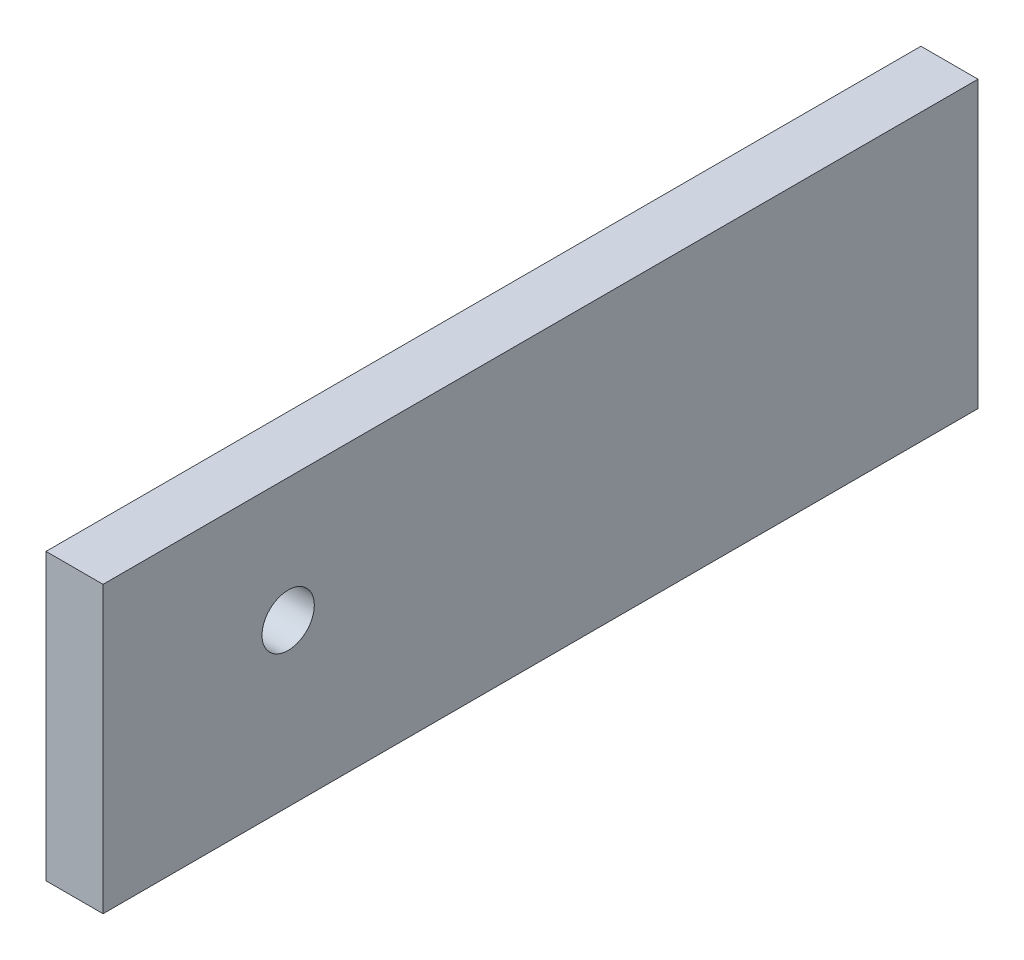
ISO-10303-21;
HEADER;
FILE_DESCRIPTION(('STEP AP214'),'2;1');
FILE_NAME('part.step','',(''),(''),'','','');
FILE_SCHEMA(('AUTOMOTIVE_DESIGN { 1 0 10303 214 1 1 1 1 }'));
ENDSEC;
DATA;
#1=APPLICATION_CONTEXT('core data for automotive mechanical design processes');
#2=APPLICATION_PROTOCOL_DEFINITION('international standard','automotive_design',2000,#1);
#3=PRODUCT_CONTEXT('',#1,'mechanical');
#4=PRODUCT('Part','Part','',(#3));
#5=PRODUCT_RELATED_PRODUCT_CATEGORY('part','',(#4));
#6=PRODUCT_DEFINITION_FORMATION('','',#4);
#7=PRODUCT_DEFINITION_CONTEXT('part definition',#1,'design');
#8=PRODUCT_DEFINITION('design','',#6,#7);
#9=PRODUCT_DEFINITION_SHAPE('','',#8);
#10=(LENGTH_UNIT() NAMED_UNIT(*) SI_UNIT(.MILLI.,.METRE.));
#11=(NAMED_UNIT(*) PLANE_ANGLE_UNIT() SI_UNIT($,.RADIAN.));
#12=(NAMED_UNIT(*) SI_UNIT($,.STERADIAN.) SOLID_ANGLE_UNIT());
#13=UNCERTAINTY_MEASURE_WITH_UNIT(LENGTH_MEASURE(1.E-05),#10,'distance_accuracy_value','');
#14=(GEOMETRIC_REPRESENTATION_CONTEXT(3) GLOBAL_UNCERTAINTY_ASSIGNED_CONTEXT((#13)) GLOBAL_UNIT_ASSIGNED_CONTEXT((#10,
#11,#12)) REPRESENTATION_CONTEXT('',''));
#15=CARTESIAN_POINT('',(0.,0.,0.));
#16=DIRECTION('',(0.,0.,1.));
#17=DIRECTION('',(1.,0.,0.));
#18=AXIS2_PLACEMENT_3D('',#15,#16,#17);
#19=CARTESIAN_POINT('',(3.0019,7.,12.0014));
#20=DIRECTION('',(0.,0.,1.));
#21=DIRECTION('',(1.,0.,0.));
#22=AXIS2_PLACEMENT_3D('',#19,#20,#21);
#23=PLANE('',#22);
#24=CARTESIAN_POINT('',(3.0019,7.,12.0014));
#25=DIRECTION('',(0.,0.,1.));
#26=DIRECTION('',(1.,0.,0.));
#27=AXIS2_PLACEMENT_3D('',#24,#25,#26);
#28=CIRCLE('',#27,2.);
#29=CARTESIAN_POINT('',(5.0019,7.,12.0014));
#30=VERTEX_POINT('',#29);
#31=EDGE_CURVE('E19',#30,#30,#28,.F.);
#32=ORIENTED_EDGE('',*,*,#31,.T.);
#33=EDGE_LOOP('',(#32));
#34=FACE_BOUND('',#33,.T.);
#35=ADVANCED_FACE('F16',(#34),#23,.F.);
#36=CARTESIAN_POINT('',(3.0019,23.,12.0014));
#37=DIRECTION('',(0.,0.,1.));
#38=DIRECTION('',(1.,0.,0.));
#39=AXIS2_PLACEMENT_3D('',#36,#37,#38);
#40=PLANE('',#39);
#41=CARTESIAN_POINT('',(3.0019,23.,12.0014));
#42=DIRECTION('',(0.,0.,1.));
#43=DIRECTION('',(1.,0.,0.));
#44=AXIS2_PLACEMENT_3D('',#41,#42,#43);
#45=CIRCLE('',#44,2.);
#46=CARTESIAN_POINT('',(5.0019,23.,12.0014));
#47=VERTEX_POINT('',#46);
#48=EDGE_CURVE('E72',#47,#47,#45,.F.);
#49=ORIENTED_EDGE('',*,*,#48,.T.);
#50=EDGE_LOOP('',(#49));
#51=FACE_BOUND('',#50,.T.);
#52=ADVANCED_FACE('F102',(#51),#40,.F.);
#53=CARTESIAN_POINT('',(3.0019,7.,0.001400000000103));
#54=DIRECTION('',(0.,0.,1.));
#55=DIRECTION('',(1.,0.,0.));
#56=AXIS2_PLACEMENT_3D('',#53,#54,#55);
#57=CYLINDRICAL_SURFACE('',#56,2.);
#58=CARTESIAN_POINT('',(3.0019,7.,0.00139999999999));
#59=DIRECTION('',(0.,0.,1.));
#60=DIRECTION('',(1.,0.,0.));
#61=AXIS2_PLACEMENT_3D('',#58,#59,#60);
#62=CIRCLE('',#61,2.);
#63=CARTESIAN_POINT('',(5.0019,7.,0.00139999999999));
#64=VERTEX_POINT('',#63);
#65=EDGE_CURVE('E78',#64,#64,#62,.F.);
#66=ORIENTED_EDGE('',*,*,#65,.T.);
#67=EDGE_LOOP('',(#66));
#68=FACE_BOUND('',#67,.T.);
#69=ORIENTED_EDGE('',*,*,#31,.F.);
#70=EDGE_LOOP('',(#69));
#71=FACE_BOUND('',#70,.T.);
#72=ADVANCED_FACE('F99',(#68,#71),#57,.F.);
#73=CARTESIAN_POINT('',(3.0019,23.,0.001400000000103));
#74=DIRECTION('',(0.,0.,1.));
#75=DIRECTION('',(1.,0.,0.));
#76=AXIS2_PLACEMENT_3D('',#73,#74,#75);
#77=CYLINDRICAL_SURFACE('',#76,2.);
#78=CARTESIAN_POINT('',(3.0019,23.,0.00139999999999));
#79=DIRECTION('',(0.,0.,1.));
#80=DIRECTION('',(1.,0.,0.));
#81=AXIS2_PLACEMENT_3D('',#78,#79,#80);
#82=CIRCLE('',#81,2.);
#83=CARTESIAN_POINT('',(5.0019,23.,0.00139999999999));
#84=VERTEX_POINT('',#83);
#85=EDGE_CURVE('E81',#84,#84,#82,.F.);
#86=ORIENTED_EDGE('',*,*,#85,.T.);
#87=EDGE_LOOP('',(#86));
#88=FACE_BOUND('',#87,.T.);
#89=ORIENTED_EDGE('',*,*,#48,.F.);
#90=EDGE_LOOP('',(#89));
#91=FACE_BOUND('',#90,.T.);
#92=ADVANCED_FACE('F101',(#88,#91),#77,.F.);
#93=CARTESIAN_POINT('',(0.001899999999978,0.,0.001400000000103));
#94=DIRECTION('',(1.,0.,0.));
#95=DIRECTION('',(0.,0.,-1.));
#96=AXIS2_PLACEMENT_3D('',#93,#94,#95);
#97=PLANE('',#96);
#98=CARTESIAN_POINT('',(0.001899999999978,17.,72.537298384862));
#99=DIRECTION('',(1.,0.,0.));
#100=DIRECTION('',(0.,0.,-1.));
#101=AXIS2_PLACEMENT_3D('',#98,#99,#100);
#102=CIRCLE('',#101,2.75);
#103=CARTESIAN_POINT('',(0.001899999999978,17.,69.787298384862));
#104=VERTEX_POINT('',#103);
#105=EDGE_CURVE('E87',#104,#104,#102,.T.);
#106=ORIENTED_EDGE('',*,*,#105,.T.);
#107=EDGE_LOOP('',(#106));
#108=FACE_BOUND('',#107,.T.);
#109=DIRECTION('',(0.,0.,1.));
#110=VECTOR('',#109,1.);
#111=CARTESIAN_POINT('',(0.001899999999978,30.,0.001400000000103));
#112=LINE('',#111,#110);
#113=CARTESIAN_POINT('',(0.001899999999978,30.,0.0014000000000465));
#114=VERTEX_POINT('',#113);
#115=CARTESIAN_POINT('',(0.001899999999978,30.,92.0014));
#116=VERTEX_POINT('',#115);
#117=EDGE_CURVE('E62',#114,#116,#112,.T.);
#118=ORIENTED_EDGE('',*,*,#117,.F.);
#119=DIRECTION('',(0.,1.,0.));
#120=VECTOR('',#119,1.);
#121=CARTESIAN_POINT('',(0.001899999999978,0.,0.001400000000103));
#122=LINE('',#121,#120);
#123=CARTESIAN_POINT('',(0.001899999999978,0.,0.00140000000001825));
#124=VERTEX_POINT('',#123);
#125=EDGE_CURVE('E55',#114,#124,#122,.F.);
#126=ORIENTED_EDGE('',*,*,#125,.T.);
#127=DIRECTION('',(0.,0.,1.));
#128=VECTOR('',#127,1.);
#129=CARTESIAN_POINT('',(0.001899999999978,0.,0.001400000000103));
#130=LINE('',#129,#128);
#131=CARTESIAN_POINT('',(0.001899999999978,0.,92.0014));
#132=VERTEX_POINT('',#131);
#133=EDGE_CURVE('E60',#124,#132,#130,.T.);
#134=ORIENTED_EDGE('',*,*,#133,.T.);
#135=DIRECTION('',(0.,1.,0.));
#136=VECTOR('',#135,1.);
#137=CARTESIAN_POINT('',(0.001899999999978,0.,92.0014));
#138=LINE('',#137,#136);
#139=EDGE_CURVE('E225',#116,#132,#138,.F.);
#140=ORIENTED_EDGE('',*,*,#139,.F.);
#141=EDGE_LOOP('',(#118,#126,#134,#140));
#142=FACE_BOUND('',#141,.T.);
#143=ADVANCED_FACE('F59',(#108,#142),#97,.F.);
#144=CARTESIAN_POINT('',(0.001899999999978,0.,0.001400000000103));
#145=DIRECTION('',(0.,1.,0.));
#146=DIRECTION('',(0.,0.,1.));
#147=AXIS2_PLACEMENT_3D('',#144,#145,#146);
#148=PLANE('',#147);
#149=DIRECTION('',(1.,0.,0.));
#150=VECTOR('',#149,1.);
#151=CARTESIAN_POINT('',(0.001899999999978,0.,92.0014));
#152=LINE('',#151,#150);
#153=CARTESIAN_POINT('',(6.0019,0.,92.0014));
#154=VERTEX_POINT('',#153);
#155=EDGE_CURVE('E70',#132,#154,#152,.T.);
#156=ORIENTED_EDGE('',*,*,#155,.F.);
#157=ORIENTED_EDGE('',*,*,#133,.F.);
#158=DIRECTION('',(1.,0.,0.));
#159=VECTOR('',#158,1.);
#160=CARTESIAN_POINT('',(0.001899999999978,0.,0.001400000000103));
#161=LINE('',#160,#159);
#162=CARTESIAN_POINT('',(6.0019,0.,0.00140000000001825));
#163=VERTEX_POINT('',#162);
#164=EDGE_CURVE('E64',#124,#163,#161,.T.);
#165=ORIENTED_EDGE('',*,*,#164,.T.);
#166=DIRECTION('',(0.,0.,-1.));
#167=VECTOR('',#166,1.);
#168=CARTESIAN_POINT('',(6.0019,0.,0.001400000000103));
#169=LINE('',#168,#167);
#170=EDGE_CURVE('E90',#154,#163,#169,.T.);
#171=ORIENTED_EDGE('',*,*,#170,.F.);
#172=EDGE_LOOP('',(#156,#157,#165,#171));
#173=FACE_BOUND('',#172,.T.);
#174=ADVANCED_FACE('F67',(#173),#148,.F.);
#175=CARTESIAN_POINT('',(0.001899999999978,0.,0.001400000000103));
#176=DIRECTION('',(0.,0.,1.));
#177=DIRECTION('',(1.,0.,0.));
#178=AXIS2_PLACEMENT_3D('',#175,#176,#177);
#179=PLANE('',#178);
#180=ORIENTED_EDGE('',*,*,#85,.F.);
#181=EDGE_LOOP('',(#180));
#182=FACE_BOUND('',#181,.T.);
#183=ORIENTED_EDGE('',*,*,#65,.F.);
#184=EDGE_LOOP('',(#183));
#185=FACE_BOUND('',#184,.T.);
#186=DIRECTION('',(0.,1.,0.));
#187=VECTOR('',#186,1.);
#188=CARTESIAN_POINT('',(6.0019,0.,0.00139999999999));
#189=LINE('',#188,#187);
#190=CARTESIAN_POINT('',(6.0019,30.,0.0014000000000465));
#191=VERTEX_POINT('',#190);
#192=EDGE_CURVE('E76',#163,#191,#189,.T.);
#193=ORIENTED_EDGE('',*,*,#192,.F.);
#194=ORIENTED_EDGE('',*,*,#164,.F.);
#195=ORIENTED_EDGE('',*,*,#125,.F.);
#196=DIRECTION('',(1.,0.,0.));
#197=VECTOR('',#196,1.);
#198=CARTESIAN_POINT('',(0.001899999999978,30.,0.00139999999999));
#199=LINE('',#198,#197);
#200=EDGE_CURVE('E84',#191,#114,#199,.F.);
#201=ORIENTED_EDGE('',*,*,#200,.F.);
#202=EDGE_LOOP('',(#193,#194,#195,#201));
#203=FACE_BOUND('',#202,.T.);
#204=ADVANCED_FACE('F74',(#182,#185,#203),#179,.F.);
#205=CARTESIAN_POINT('',(0.001899999999978,30.,0.001400000000103));
#206=DIRECTION('',(0.,1.,0.));
#207=DIRECTION('',(0.,0.,1.));
#208=AXIS2_PLACEMENT_3D('',#205,#206,#207);
#209=PLANE('',#208);
#210=DIRECTION('',(1.,0.,0.));
#211=VECTOR('',#210,1.);
#212=CARTESIAN_POINT('',(0.001899999999978,30.,92.0014));
#213=LINE('',#212,#211);
#214=CARTESIAN_POINT('',(6.0019,30.,92.0014));
#215=VERTEX_POINT('',#214);
#216=EDGE_CURVE('E34',#215,#116,#213,.F.);
#217=ORIENTED_EDGE('',*,*,#216,.F.);
#218=DIRECTION('',(0.,0.,-1.));
#219=VECTOR('',#218,1.);
#220=CARTESIAN_POINT('',(6.0019,30.,0.001400000000103));
#221=LINE('',#220,#219);
#222=EDGE_CURVE('E217',#191,#215,#221,.F.);
#223=ORIENTED_EDGE('',*,*,#222,.F.);
#224=ORIENTED_EDGE('',*,*,#200,.T.);
#225=ORIENTED_EDGE('',*,*,#117,.T.);
#226=EDGE_LOOP('',(#217,#223,#224,#225));
#227=FACE_BOUND('',#226,.T.);
#228=ADVANCED_FACE('F127',(#227),#209,.T.);
#229=CARTESIAN_POINT('',(0.001899999999978,0.,92.0014));
#230=DIRECTION('',(0.,0.,1.));
#231=DIRECTION('',(1.,0.,0.));
#232=AXIS2_PLACEMENT_3D('',#229,#230,#231);
#233=PLANE('',#232);
#234=DIRECTION('',(0.,1.,0.));
#235=VECTOR('',#234,1.);
#236=CARTESIAN_POINT('',(6.0019,0.,92.0014));
#237=LINE('',#236,#235);
#238=EDGE_CURVE('E25',#215,#154,#237,.F.);
#239=ORIENTED_EDGE('',*,*,#238,.F.);
#240=ORIENTED_EDGE('',*,*,#216,.T.);
#241=ORIENTED_EDGE('',*,*,#139,.T.);
#242=ORIENTED_EDGE('',*,*,#155,.T.);
#243=EDGE_LOOP('',(#239,#240,#241,#242));
#244=FACE_BOUND('',#243,.T.);
#245=ADVANCED_FACE('F120',(#244),#233,.T.);
#246=CARTESIAN_POINT('',(0.001899999999978,17.,72.537298384862));
#247=DIRECTION('',(1.,0.,0.));
#248=DIRECTION('',(0.,0.,-1.));
#249=AXIS2_PLACEMENT_3D('',#246,#247,#248);
#250=CYLINDRICAL_SURFACE('',#249,2.75);
#251=ORIENTED_EDGE('',*,*,#105,.F.);
#252=EDGE_LOOP('',(#251));
#253=FACE_BOUND('',#252,.T.);
#254=CARTESIAN_POINT('',(6.0019,17.,72.537298384862));
#255=DIRECTION('',(1.,0.,0.));
#256=DIRECTION('',(0.,0.,-1.));
#257=AXIS2_PLACEMENT_3D('',#254,#255,#256);
#258=CIRCLE('',#257,2.75);
#259=CARTESIAN_POINT('',(6.0019,17.,69.787298384862));
#260=VERTEX_POINT('',#259);
#261=EDGE_CURVE('E11',#260,#260,#258,.F.);
#262=ORIENTED_EDGE('',*,*,#261,.F.);
#263=EDGE_LOOP('',(#262));
#264=FACE_BOUND('',#263,.T.);
#265=ADVANCED_FACE('F114',(#253,#264),#250,.F.);
#266=CARTESIAN_POINT('',(6.0019,0.,0.001400000000103));
#267=DIRECTION('',(1.,0.,0.));
#268=DIRECTION('',(0.,0.,-1.));
#269=AXIS2_PLACEMENT_3D('',#266,#267,#268);
#270=PLANE('',#269);
#271=ORIENTED_EDGE('',*,*,#261,.T.);
#272=EDGE_LOOP('',(#271));
#273=FACE_BOUND('',#272,.T.);
#274=ORIENTED_EDGE('',*,*,#222,.T.);
#275=ORIENTED_EDGE('',*,*,#238,.T.);
#276=ORIENTED_EDGE('',*,*,#170,.T.);
#277=ORIENTED_EDGE('',*,*,#192,.T.);
#278=EDGE_LOOP('',(#274,#275,#276,#277));
#279=FACE_BOUND('',#278,.T.);
#280=ADVANCED_FACE('F112',(#273,#279),#270,.T.);
#281=CLOSED_SHELL('',(#35,#52,#72,#92,#143,#174,#204,#228,#245,#265,#280));
#282=MANIFOLD_SOLID_BREP('B1',#281);
#283=ADVANCED_BREP_SHAPE_REPRESENTATION('',(#18,#282),#14);
#284=SHAPE_DEFINITION_REPRESENTATION(#9,#283);
ENDSEC;
END-ISO-10303-21;
